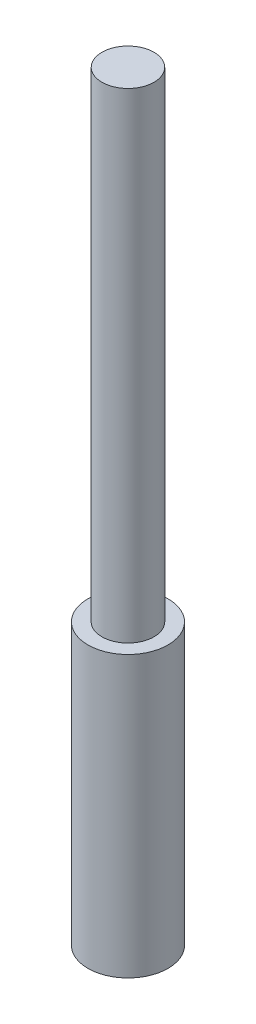
ISO-10303-21;
HEADER;
FILE_DESCRIPTION(('STEP AP214'),'2;1');
FILE_NAME('part.step','',(''),(''),'','','');
FILE_SCHEMA(('AUTOMOTIVE_DESIGN { 1 0 10303 214 1 1 1 1 }'));
ENDSEC;
DATA;
#1=APPLICATION_CONTEXT('core data for automotive mechanical design processes');
#2=APPLICATION_PROTOCOL_DEFINITION('international standard','automotive_design',2000,#1);
#3=PRODUCT_CONTEXT('',#1,'mechanical');
#4=PRODUCT('Part','Part','',(#3));
#5=PRODUCT_RELATED_PRODUCT_CATEGORY('part','',(#4));
#6=PRODUCT_DEFINITION_FORMATION('','',#4);
#7=PRODUCT_DEFINITION_CONTEXT('part definition',#1,'design');
#8=PRODUCT_DEFINITION('design','',#6,#7);
#9=PRODUCT_DEFINITION_SHAPE('','',#8);
#10=(LENGTH_UNIT() NAMED_UNIT(*) SI_UNIT(.MILLI.,.METRE.));
#11=(NAMED_UNIT(*) PLANE_ANGLE_UNIT() SI_UNIT($,.RADIAN.));
#12=(NAMED_UNIT(*) SI_UNIT($,.STERADIAN.) SOLID_ANGLE_UNIT());
#13=UNCERTAINTY_MEASURE_WITH_UNIT(LENGTH_MEASURE(1.E-05),#10,'distance_accuracy_value','');
#14=(GEOMETRIC_REPRESENTATION_CONTEXT(3) GLOBAL_UNCERTAINTY_ASSIGNED_CONTEXT((#13)) GLOBAL_UNIT_ASSIGNED_CONTEXT((#10,
#11,#12)) REPRESENTATION_CONTEXT('',''));
#15=CARTESIAN_POINT('',(0.,0.,0.));
#16=DIRECTION('',(0.,0.,1.));
#17=DIRECTION('',(1.,0.,0.));
#18=AXIS2_PLACEMENT_3D('',#15,#16,#17);
#19=CARTESIAN_POINT('',(0.,95.,0.));
#20=DIRECTION('',(0.,-1.,0.));
#21=DIRECTION('',(0.,0.,-1.));
#22=AXIS2_PLACEMENT_3D('',#19,#20,#21);
#23=CYLINDRICAL_SURFACE('',#22,5.);
#24=CARTESIAN_POINT('',(0.,0.,0.));
#25=DIRECTION('',(0.,1.,0.));
#26=DIRECTION('',(0.,0.,1.));
#27=AXIS2_PLACEMENT_3D('',#24,#25,#26);
#28=CIRCLE('',#27,5.);
#29=CARTESIAN_POINT('',(0.,0.,5.));
#30=VERTEX_POINT('',#29);
#31=EDGE_CURVE('E10',#30,#30,#28,.T.);
#32=ORIENTED_EDGE('',*,*,#31,.T.);
#33=EDGE_LOOP('',(#32));
#34=FACE_BOUND('',#33,.T.);
#35=CARTESIAN_POINT('',(0.,35.,0.));
#36=DIRECTION('',(0.,1.,0.));
#37=DIRECTION('',(0.,0.,1.));
#38=AXIS2_PLACEMENT_3D('',#35,#36,#37);
#39=CIRCLE('',#38,5.);
#40=CARTESIAN_POINT('',(0.,35.,5.));
#41=VERTEX_POINT('',#40);
#42=EDGE_CURVE('E37',#41,#41,#39,.T.);
#43=ORIENTED_EDGE('',*,*,#42,.F.);
#44=EDGE_LOOP('',(#43));
#45=FACE_BOUND('',#44,.T.);
#46=ADVANCED_FACE('F31',(#34,#45),#23,.T.);
#47=CARTESIAN_POINT('',(0.,0.,0.));
#48=DIRECTION('',(0.,1.,0.));
#49=DIRECTION('',(0.,0.,1.));
#50=AXIS2_PLACEMENT_3D('',#47,#48,#49);
#51=PLANE('',#50);
#52=ORIENTED_EDGE('',*,*,#31,.F.);
#53=EDGE_LOOP('',(#52));
#54=FACE_BOUND('',#53,.T.);
#55=ADVANCED_FACE('F63',(#54),#51,.F.);
#56=CARTESIAN_POINT('',(0.,35.,0.));
#57=DIRECTION('',(0.,1.,0.));
#58=DIRECTION('',(0.,0.,1.));
#59=AXIS2_PLACEMENT_3D('',#56,#57,#58);
#60=PLANE('',#59);
#61=CARTESIAN_POINT('',(0.,35.,0.));
#62=DIRECTION('',(0.,1.,0.));
#63=DIRECTION('',(0.,0.,1.));
#64=AXIS2_PLACEMENT_3D('',#61,#62,#63);
#65=CIRCLE('',#64,3.25);
#66=CARTESIAN_POINT('',(0.,35.,3.25));
#67=VERTEX_POINT('',#66);
#68=EDGE_CURVE('E41',#67,#67,#65,.T.);
#69=ORIENTED_EDGE('',*,*,#68,.F.);
#70=EDGE_LOOP('',(#69));
#71=FACE_BOUND('',#70,.T.);
#72=ORIENTED_EDGE('',*,*,#42,.T.);
#73=EDGE_LOOP('',(#72));
#74=FACE_BOUND('',#73,.T.);
#75=ADVANCED_FACE('F55',(#71,#74),#60,.T.);
#76=CARTESIAN_POINT('',(0.,35.,0.));
#77=DIRECTION('',(0.,1.,0.));
#78=DIRECTION('',(0.,0.,1.));
#79=AXIS2_PLACEMENT_3D('',#76,#77,#78);
#80=CYLINDRICAL_SURFACE('',#79,3.25);
#81=ORIENTED_EDGE('',*,*,#68,.T.);
#82=EDGE_LOOP('',(#81));
#83=FACE_BOUND('',#82,.T.);
#84=CARTESIAN_POINT('',(0.,95.,0.));
#85=DIRECTION('',(0.,1.,0.));
#86=DIRECTION('',(0.,0.,1.));
#87=AXIS2_PLACEMENT_3D('',#84,#85,#86);
#88=CIRCLE('',#87,3.25);
#89=CARTESIAN_POINT('',(0.,95.,3.25));
#90=VERTEX_POINT('',#89);
#91=EDGE_CURVE('E45',#90,#90,#88,.T.);
#92=ORIENTED_EDGE('',*,*,#91,.F.);
#93=EDGE_LOOP('',(#92));
#94=FACE_BOUND('',#93,.T.);
#95=ADVANCED_FACE('F53',(#83,#94),#80,.T.);
#96=CARTESIAN_POINT('',(0.,95.,0.));
#97=DIRECTION('',(0.,1.,0.));
#98=DIRECTION('',(0.,0.,1.));
#99=AXIS2_PLACEMENT_3D('',#96,#97,#98);
#100=PLANE('',#99);
#101=ORIENTED_EDGE('',*,*,#91,.T.);
#102=EDGE_LOOP('',(#101));
#103=FACE_BOUND('',#102,.T.);
#104=ADVANCED_FACE('F51',(#103),#100,.T.);
#105=CLOSED_SHELL('',(#46,#55,#75,#95,#104));
#106=MANIFOLD_SOLID_BREP('B2',#105);
#107=ADVANCED_BREP_SHAPE_REPRESENTATION('',(#18,#106),#14);
#108=SHAPE_DEFINITION_REPRESENTATION(#9,#107);
ENDSEC;
END-ISO-10303-21;
